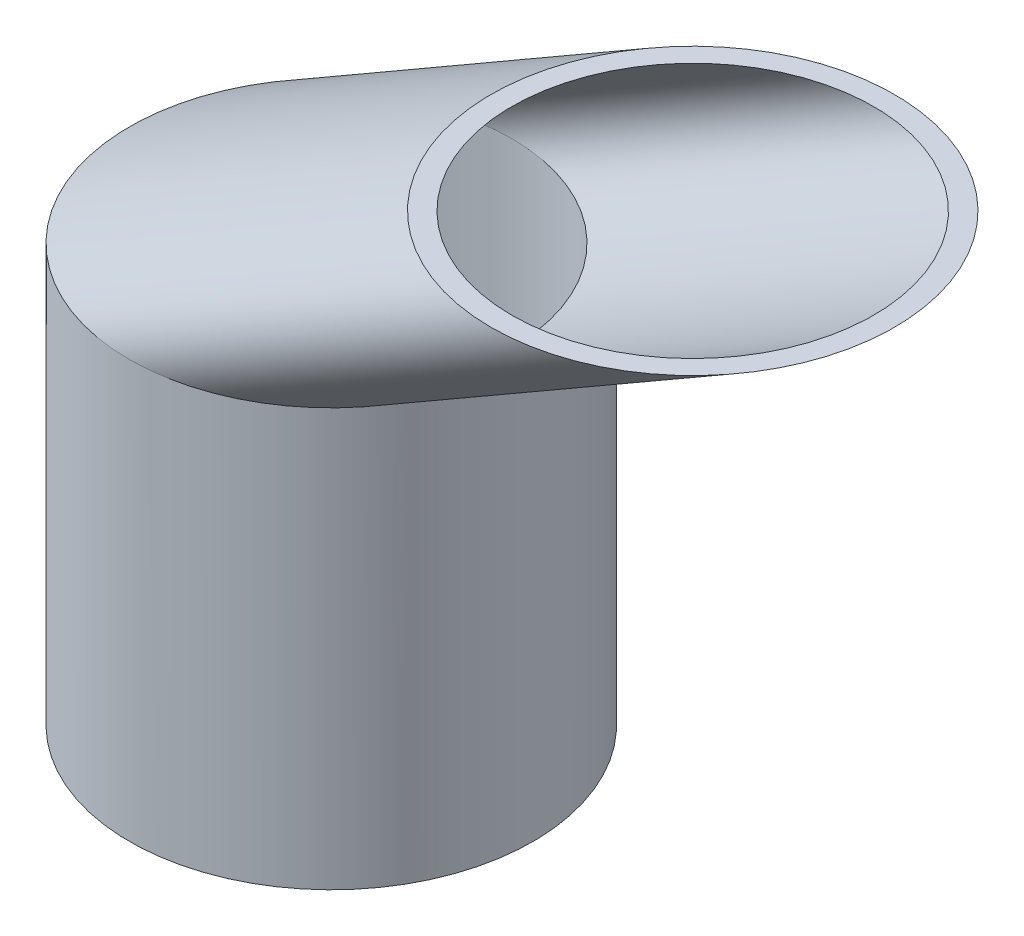
ISO-10303-21;
HEADER;
FILE_DESCRIPTION(('STEP AP214'),'2;1');
FILE_NAME('part.step','',(''),(''),'','','');
FILE_SCHEMA(('AUTOMOTIVE_DESIGN { 1 0 10303 214 1 1 1 1 }'));
ENDSEC;
DATA;
#1=APPLICATION_CONTEXT('core data for automotive mechanical design processes');
#2=APPLICATION_PROTOCOL_DEFINITION('international standard','automotive_design',2000,#1);
#3=PRODUCT_CONTEXT('',#1,'mechanical');
#4=PRODUCT('Part','Part','',(#3));
#5=PRODUCT_RELATED_PRODUCT_CATEGORY('part','',(#4));
#6=PRODUCT_DEFINITION_FORMATION('','',#4);
#7=PRODUCT_DEFINITION_CONTEXT('part definition',#1,'design');
#8=PRODUCT_DEFINITION('design','',#6,#7);
#9=PRODUCT_DEFINITION_SHAPE('','',#8);
#10=(LENGTH_UNIT() NAMED_UNIT(*) SI_UNIT(.MILLI.,.METRE.));
#11=(NAMED_UNIT(*) PLANE_ANGLE_UNIT() SI_UNIT($,.RADIAN.));
#12=(NAMED_UNIT(*) SI_UNIT($,.STERADIAN.) SOLID_ANGLE_UNIT());
#13=UNCERTAINTY_MEASURE_WITH_UNIT(LENGTH_MEASURE(1.E-05),#10,'distance_accuracy_value','');
#14=(GEOMETRIC_REPRESENTATION_CONTEXT(3) GLOBAL_UNCERTAINTY_ASSIGNED_CONTEXT((#13)) GLOBAL_UNIT_ASSIGNED_CONTEXT((#10,
#11,#12)) REPRESENTATION_CONTEXT('',''));
#15=CARTESIAN_POINT('',(0.,0.,0.));
#16=DIRECTION('',(0.,0.,1.));
#17=DIRECTION('',(1.,0.,0.));
#18=AXIS2_PLACEMENT_3D('',#15,#16,#17);
#19=CARTESIAN_POINT('',(0.,0.,0.));
#20=DIRECTION('',(0.,1.,0.));
#21=DIRECTION('',(0.,0.,1.));
#22=AXIS2_PLACEMENT_3D('',#19,#20,#21);
#23=PLANE('',#22);
#24=CARTESIAN_POINT('',(0.,0.,0.));
#25=DIRECTION('',(0.,1.,0.));
#26=DIRECTION('',(0.,0.,1.));
#27=AXIS2_PLACEMENT_3D('',#24,#25,#26);
#28=CIRCLE('',#27,18.415);
#29=CARTESIAN_POINT('',(0.,0.,-18.415));
#30=VERTEX_POINT('',#29);
#31=EDGE_CURVE('E35',#30,#30,#28,.T.);
#32=ORIENTED_EDGE('',*,*,#31,.F.);
#33=EDGE_LOOP('',(#32));
#34=FACE_BOUND('',#33,.T.);
#35=CARTESIAN_POINT('',(0.,0.,0.));
#36=DIRECTION('',(0.,1.,0.));
#37=DIRECTION('',(0.,0.,1.));
#38=AXIS2_PLACEMENT_3D('',#35,#36,#37);
#39=CIRCLE('',#38,16.51);
#40=CARTESIAN_POINT('',(0.,0.,-16.51));
#41=VERTEX_POINT('',#40);
#42=EDGE_CURVE('E42',#41,#41,#39,.T.);
#43=ORIENTED_EDGE('',*,*,#42,.T.);
#44=EDGE_LOOP('',(#43));
#45=FACE_BOUND('',#44,.T.);
#46=ADVANCED_FACE('F31',(#34,#45),#23,.F.);
#47=CARTESIAN_POINT('',(0.,38.1,0.));
#48=DIRECTION('',(0.,-1.,0.));
#49=DIRECTION('',(0.,0.,-1.));
#50=AXIS2_PLACEMENT_3D('',#47,#48,#49);
#51=CYLINDRICAL_SURFACE('',#50,18.415);
#52=CARTESIAN_POINT('',(0.,38.1,0.));
#53=DIRECTION('',(0.,1.,0.));
#54=DIRECTION('',(0.,0.,1.));
#55=AXIS2_PLACEMENT_3D('',#52,#53,#54);
#56=CIRCLE('',#55,18.415);
#57=CARTESIAN_POINT('',(0.,38.1,-18.415));
#58=VERTEX_POINT('',#57);
#59=EDGE_CURVE('E10',#58,#58,#56,.T.);
#60=CARTESIAN_POINT('',(0.,38.1,-18.415));
#61=CARTESIAN_POINT('',(0.,37.703125,-18.415));
#62=CARTESIAN_POINT('',(0.,37.30625,-18.415));
#63=CARTESIAN_POINT('',(0.,36.5125,-18.415));
#64=CARTESIAN_POINT('',(0.,36.115625,-18.415));
#65=CARTESIAN_POINT('',(0.,35.321875,-18.415));
#66=CARTESIAN_POINT('',(0.,34.925,-18.415));
#67=CARTESIAN_POINT('',(0.,34.13125,-18.415));
#68=CARTESIAN_POINT('',(0.,33.734375,-18.415));
#69=CARTESIAN_POINT('',(0.,32.940625,-18.415));
#70=CARTESIAN_POINT('',(0.,32.54375,-18.415));
#71=CARTESIAN_POINT('',(0.,31.75,-18.415));
#72=CARTESIAN_POINT('',(0.,31.353125,-18.415));
#73=CARTESIAN_POINT('',(0.,30.559375,-18.415));
#74=CARTESIAN_POINT('',(0.,30.1625,-18.415));
#75=CARTESIAN_POINT('',(0.,29.36875,-18.415));
#76=CARTESIAN_POINT('',(0.,28.971875,-18.415));
#77=CARTESIAN_POINT('',(0.,28.178125,-18.415));
#78=CARTESIAN_POINT('',(0.,27.78125,-18.415));
#79=CARTESIAN_POINT('',(0.,26.9875,-18.415));
#80=CARTESIAN_POINT('',(0.,26.590625,-18.415));
#81=CARTESIAN_POINT('',(0.,25.796875,-18.415));
#82=CARTESIAN_POINT('',(0.,25.4,-18.415));
#83=CARTESIAN_POINT('',(0.,24.60625,-18.415));
#84=CARTESIAN_POINT('',(0.,24.209375,-18.415));
#85=CARTESIAN_POINT('',(0.,23.415625,-18.415));
#86=CARTESIAN_POINT('',(0.,23.01875,-18.415));
#87=CARTESIAN_POINT('',(0.,22.225,-18.415));
#88=CARTESIAN_POINT('',(0.,21.828125,-18.415));
#89=CARTESIAN_POINT('',(0.,21.034375,-18.415));
#90=CARTESIAN_POINT('',(0.,20.6375,-18.415));
#91=CARTESIAN_POINT('',(0.,19.84375,-18.415));
#92=CARTESIAN_POINT('',(0.,19.446875,-18.415));
#93=CARTESIAN_POINT('',(0.,18.653125,-18.415));
#94=CARTESIAN_POINT('',(0.,18.25625,-18.415));
#95=CARTESIAN_POINT('',(0.,17.4625,-18.415));
#96=CARTESIAN_POINT('',(0.,17.065625,-18.415));
#97=CARTESIAN_POINT('',(0.,16.271875,-18.415));
#98=CARTESIAN_POINT('',(0.,15.875,-18.415));
#99=CARTESIAN_POINT('',(0.,15.08125,-18.415));
#100=CARTESIAN_POINT('',(0.,14.684375,-18.415));
#101=CARTESIAN_POINT('',(0.,13.890625,-18.415));
#102=CARTESIAN_POINT('',(0.,13.49375,-18.415));
#103=CARTESIAN_POINT('',(0.,12.7,-18.415));
#104=CARTESIAN_POINT('',(0.,12.303125,-18.415));
#105=CARTESIAN_POINT('',(0.,11.509375,-18.415));
#106=CARTESIAN_POINT('',(0.,11.1125,-18.415));
#107=CARTESIAN_POINT('',(0.,10.31875,-18.415));
#108=CARTESIAN_POINT('',(0.,9.921875,-18.415));
#109=CARTESIAN_POINT('',(0.,9.128125,-18.415));
#110=CARTESIAN_POINT('',(0.,8.73125,-18.415));
#111=CARTESIAN_POINT('',(0.,7.9375,-18.415));
#112=CARTESIAN_POINT('',(0.,7.540625,-18.415));
#113=CARTESIAN_POINT('',(0.,6.746875,-18.415));
#114=CARTESIAN_POINT('',(0.,6.35,-18.415));
#115=CARTESIAN_POINT('',(0.,5.55625,-18.415));
#116=CARTESIAN_POINT('',(0.,5.159375,-18.415));
#117=CARTESIAN_POINT('',(0.,4.365625,-18.415));
#118=CARTESIAN_POINT('',(0.,3.96875,-18.415));
#119=CARTESIAN_POINT('',(0.,3.175,-18.415));
#120=CARTESIAN_POINT('',(0.,2.778125,-18.415));
#121=CARTESIAN_POINT('',(0.,1.984375,-18.415));
#122=CARTESIAN_POINT('',(0.,1.5875,-18.415));
#123=CARTESIAN_POINT('',(0.,0.79375,-18.415));
#124=CARTESIAN_POINT('',(0.,0.396875,-18.415));
#125=CARTESIAN_POINT('',(0.,0.,-18.415));
#126=B_SPLINE_CURVE_WITH_KNOTS('',3,(#60,#61,#62,#63,#64,#65,#66,#67,#68,#69,#70,#71,#72,#73,
#74,#75,#76,#77,#78,#79,#80,#81,#82,#83,#84,#85,#86,#87,#88,#89,#90,#91,#92,#93,#94,#95,#96,#97,
#98,#99,#100,#101,#102,#103,#104,#105,#106,#107,#108,#109,#110,#111,#112,#113,#114,#115,#116,
#117,#118,#119,#120,#121,#122,#123,#124,#125),.UNSPECIFIED.,.F.,.F.,(4,2,2,2,2,2,2,2,2,2,2,2,2,
2,2,2,2,2,2,2,2,2,2,2,2,2,2,2,2,2,2,2,4),(0.,1.19062499999999,2.38124999999999,3.571875,4.7625,
5.953125,7.14375,8.33437499999999,9.525,10.715625,11.90625,13.096875,14.2875,15.478125,16.66875,
17.859375,19.05,20.240625,21.43125,22.621875,23.8125,25.003125,26.19375,27.384375,28.575,
29.765625,30.95625,32.146875,33.3375,34.528125,35.71875,36.909375,38.1),.UNSPECIFIED.);
#127=EDGE_CURVE('BSEAM33',#58,#30,#126,.T.);
#128=ORIENTED_EDGE('',*,*,#59,.F.);
#129=ORIENTED_EDGE('',*,*,#31,.T.);
#130=ORIENTED_EDGE('',*,*,#127,.T.);
#131=ORIENTED_EDGE('',*,*,#127,.F.);
#132=EDGE_LOOP('',(#128,#130,#129,#131));
#133=FACE_BOUND('',#132,.T.);
#134=ADVANCED_FACE('F33',(#133),#51,.T.);
#135=CARTESIAN_POINT('',(0.,38.1,0.));
#136=DIRECTION('',(0.,-1.,0.));
#137=DIRECTION('',(0.,0.,-1.));
#138=AXIS2_PLACEMENT_3D('',#135,#136,#137);
#139=CYLINDRICAL_SURFACE('',#138,16.51);
#140=CARTESIAN_POINT('',(0.,38.1,0.));
#141=DIRECTION('',(0.,1.,0.));
#142=DIRECTION('',(0.,0.,1.));
#143=AXIS2_PLACEMENT_3D('',#140,#141,#142);
#144=CIRCLE('',#143,16.51);
#145=CARTESIAN_POINT('',(0.,38.1,-16.51));
#146=VERTEX_POINT('',#145);
#147=EDGE_CURVE('E51',#146,#146,#144,.T.);
#148=CARTESIAN_POINT('',(0.,38.1,-16.51));
#149=CARTESIAN_POINT('',(0.,37.703125,-16.51));
#150=CARTESIAN_POINT('',(0.,37.30625,-16.51));
#151=CARTESIAN_POINT('',(0.,36.5125,-16.51));
#152=CARTESIAN_POINT('',(0.,36.115625,-16.51));
#153=CARTESIAN_POINT('',(0.,35.321875,-16.51));
#154=CARTESIAN_POINT('',(0.,34.925,-16.51));
#155=CARTESIAN_POINT('',(0.,34.13125,-16.51));
#156=CARTESIAN_POINT('',(0.,33.734375,-16.51));
#157=CARTESIAN_POINT('',(0.,32.940625,-16.51));
#158=CARTESIAN_POINT('',(0.,32.54375,-16.51));
#159=CARTESIAN_POINT('',(0.,31.75,-16.51));
#160=CARTESIAN_POINT('',(0.,31.353125,-16.51));
#161=CARTESIAN_POINT('',(0.,30.559375,-16.51));
#162=CARTESIAN_POINT('',(0.,30.1625,-16.51));
#163=CARTESIAN_POINT('',(0.,29.36875,-16.51));
#164=CARTESIAN_POINT('',(0.,28.971875,-16.51));
#165=CARTESIAN_POINT('',(0.,28.178125,-16.51));
#166=CARTESIAN_POINT('',(0.,27.78125,-16.51));
#167=CARTESIAN_POINT('',(0.,26.9875,-16.51));
#168=CARTESIAN_POINT('',(0.,26.590625,-16.51));
#169=CARTESIAN_POINT('',(0.,25.796875,-16.51));
#170=CARTESIAN_POINT('',(0.,25.4,-16.51));
#171=CARTESIAN_POINT('',(0.,24.60625,-16.51));
#172=CARTESIAN_POINT('',(0.,24.209375,-16.51));
#173=CARTESIAN_POINT('',(0.,23.415625,-16.51));
#174=CARTESIAN_POINT('',(0.,23.01875,-16.51));
#175=CARTESIAN_POINT('',(0.,22.225,-16.51));
#176=CARTESIAN_POINT('',(0.,21.828125,-16.51));
#177=CARTESIAN_POINT('',(0.,21.034375,-16.51));
#178=CARTESIAN_POINT('',(0.,20.6375,-16.51));
#179=CARTESIAN_POINT('',(0.,19.84375,-16.51));
#180=CARTESIAN_POINT('',(0.,19.446875,-16.51));
#181=CARTESIAN_POINT('',(0.,18.653125,-16.51));
#182=CARTESIAN_POINT('',(0.,18.25625,-16.51));
#183=CARTESIAN_POINT('',(0.,17.4625,-16.51));
#184=CARTESIAN_POINT('',(0.,17.065625,-16.51));
#185=CARTESIAN_POINT('',(0.,16.271875,-16.51));
#186=CARTESIAN_POINT('',(0.,15.875,-16.51));
#187=CARTESIAN_POINT('',(0.,15.08125,-16.51));
#188=CARTESIAN_POINT('',(0.,14.684375,-16.51));
#189=CARTESIAN_POINT('',(0.,13.890625,-16.51));
#190=CARTESIAN_POINT('',(0.,13.49375,-16.51));
#191=CARTESIAN_POINT('',(0.,12.7,-16.51));
#192=CARTESIAN_POINT('',(0.,12.303125,-16.51));
#193=CARTESIAN_POINT('',(0.,11.509375,-16.51));
#194=CARTESIAN_POINT('',(0.,11.1125,-16.51));
#195=CARTESIAN_POINT('',(0.,10.31875,-16.51));
#196=CARTESIAN_POINT('',(0.,9.92187499999999,-16.51));
#197=CARTESIAN_POINT('',(0.,9.128125,-16.51));
#198=CARTESIAN_POINT('',(0.,8.73124999999999,-16.51));
#199=CARTESIAN_POINT('',(0.,7.93749999999999,-16.51));
#200=CARTESIAN_POINT('',(0.,7.54062499999999,-16.51));
#201=CARTESIAN_POINT('',(0.,6.746875,-16.51));
#202=CARTESIAN_POINT('',(0.,6.35,-16.51));
#203=CARTESIAN_POINT('',(0.,5.55625,-16.51));
#204=CARTESIAN_POINT('',(0.,5.159375,-16.51));
#205=CARTESIAN_POINT('',(0.,4.365625,-16.51));
#206=CARTESIAN_POINT('',(0.,3.96875,-16.51));
#207=CARTESIAN_POINT('',(0.,3.175,-16.51));
#208=CARTESIAN_POINT('',(0.,2.778125,-16.51));
#209=CARTESIAN_POINT('',(0.,1.984375,-16.51));
#210=CARTESIAN_POINT('',(0.,1.5875,-16.51));
#211=CARTESIAN_POINT('',(0.,0.79375,-16.51));
#212=CARTESIAN_POINT('',(0.,0.396875,-16.51));
#213=CARTESIAN_POINT('',(0.,0.,-16.51));
#214=B_SPLINE_CURVE_WITH_KNOTS('',3,(#148,#149,#150,#151,#152,#153,#154,#155,#156,#157,#158,
#159,#160,#161,#162,#163,#164,#165,#166,#167,#168,#169,#170,#171,#172,#173,#174,#175,#176,#177,
#178,#179,#180,#181,#182,#183,#184,#185,#186,#187,#188,#189,#190,#191,#192,#193,#194,#195,#196,
#197,#198,#199,#200,#201,#202,#203,#204,#205,#206,#207,#208,#209,#210,#211,#212,#213),
.UNSPECIFIED.,.F.,.F.,(4,2,2,2,2,2,2,2,2,2,2,2,2,2,2,2,2,2,2,2,2,2,2,2,2,2,2,2,2,2,2,2,4),(0.,
1.190625,2.38125,3.571875,4.7625,5.953125,7.14375,8.334375,9.52500000000001,10.715625,11.90625,
13.096875,14.2875,15.478125,16.66875,17.859375,19.05,20.240625,21.43125,22.621875,23.8125,
25.003125,26.19375,27.384375,28.575,29.765625,30.95625,32.146875,33.3375,34.528125,35.71875,
36.909375,38.1),.UNSPECIFIED.);
#215=EDGE_CURVE('BSEAM62',#146,#41,#214,.T.);
#216=ORIENTED_EDGE('',*,*,#147,.T.);
#217=ORIENTED_EDGE('',*,*,#42,.F.);
#218=ORIENTED_EDGE('',*,*,#215,.T.);
#219=ORIENTED_EDGE('',*,*,#215,.F.);
#220=EDGE_LOOP('',(#216,#218,#217,#219));
#221=FACE_BOUND('',#220,.T.);
#222=ADVANCED_FACE('F62',(#221),#139,.F.);
#223=CARTESIAN_POINT('',(32.9955678841872,57.1499999999999,0.));
#224=DIRECTION('',(0.,1.,0.));
#225=DIRECTION('',(0.,0.,1.));
#226=AXIS2_PLACEMENT_3D('',#223,#224,#225);
#227=PLANE('',#226);
#228=CARTESIAN_POINT('',(32.9955678841872,57.1499999999999,0.));
#229=DIRECTION('',(0.,1.,0.));
#230=DIRECTION('',(0.,0.,1.));
#231=AXIS2_PLACEMENT_3D('',#228,#229,#230);
#232=CIRCLE('',#231,18.415);
#233=CARTESIAN_POINT('',(32.9955678841872,57.1499999999999,18.415));
#234=VERTEX_POINT('',#233);
#235=EDGE_CURVE('E46',#234,#234,#232,.T.);
#236=ORIENTED_EDGE('',*,*,#235,.T.);
#237=EDGE_LOOP('',(#236));
#238=FACE_BOUND('',#237,.T.);
#239=CARTESIAN_POINT('',(32.9955678841872,57.1499999999999,0.));
#240=DIRECTION('',(0.,1.,0.));
#241=DIRECTION('',(0.,0.,1.));
#242=AXIS2_PLACEMENT_3D('',#239,#240,#241);
#243=CIRCLE('',#242,16.51);
#244=CARTESIAN_POINT('',(32.9955678841872,57.1499999999999,16.51));
#245=VERTEX_POINT('',#244);
#246=EDGE_CURVE('E50',#245,#245,#243,.T.);
#247=ORIENTED_EDGE('',*,*,#246,.F.);
#248=EDGE_LOOP('',(#247));
#249=FACE_BOUND('',#248,.T.);
#250=ADVANCED_FACE('F59',(#238,#249),#227,.T.);
#251=DIRECTION('',(-0.86602540378444,-0.499999999999998,0.));
#252=VECTOR('',#251,1.);
#253=SURFACE_OF_LINEAR_EXTRUSION('',#232,#252);
#254=ORIENTED_EDGE('',*,*,#235,.F.);
#255=EDGE_LOOP('',(#254));
#256=FACE_BOUND('',#255,.T.);
#257=ORIENTED_EDGE('',*,*,#59,.T.);
#258=EDGE_LOOP('',(#257));
#259=FACE_BOUND('',#258,.T.);
#260=ADVANCED_FACE('F54',(#256,#259),#253,.F.);
#261=DIRECTION('',(-0.86602540378444,-0.499999999999998,0.));
#262=VECTOR('',#261,1.);
#263=SURFACE_OF_LINEAR_EXTRUSION('',#243,#262);
#264=ORIENTED_EDGE('',*,*,#246,.T.);
#265=EDGE_LOOP('',(#264));
#266=FACE_BOUND('',#265,.T.);
#267=ORIENTED_EDGE('',*,*,#147,.F.);
#268=EDGE_LOOP('',(#267));
#269=FACE_BOUND('',#268,.T.);
#270=ADVANCED_FACE('F58',(#266,#269),#263,.T.);
#271=CLOSED_SHELL('',(#46,#134,#222,#250,#260,#270));
#272=MANIFOLD_SOLID_BREP('B2',#271);
#273=ADVANCED_BREP_SHAPE_REPRESENTATION('',(#18,#272),#14);
#274=SHAPE_DEFINITION_REPRESENTATION(#9,#273);
ENDSEC;
END-ISO-10303-21;
